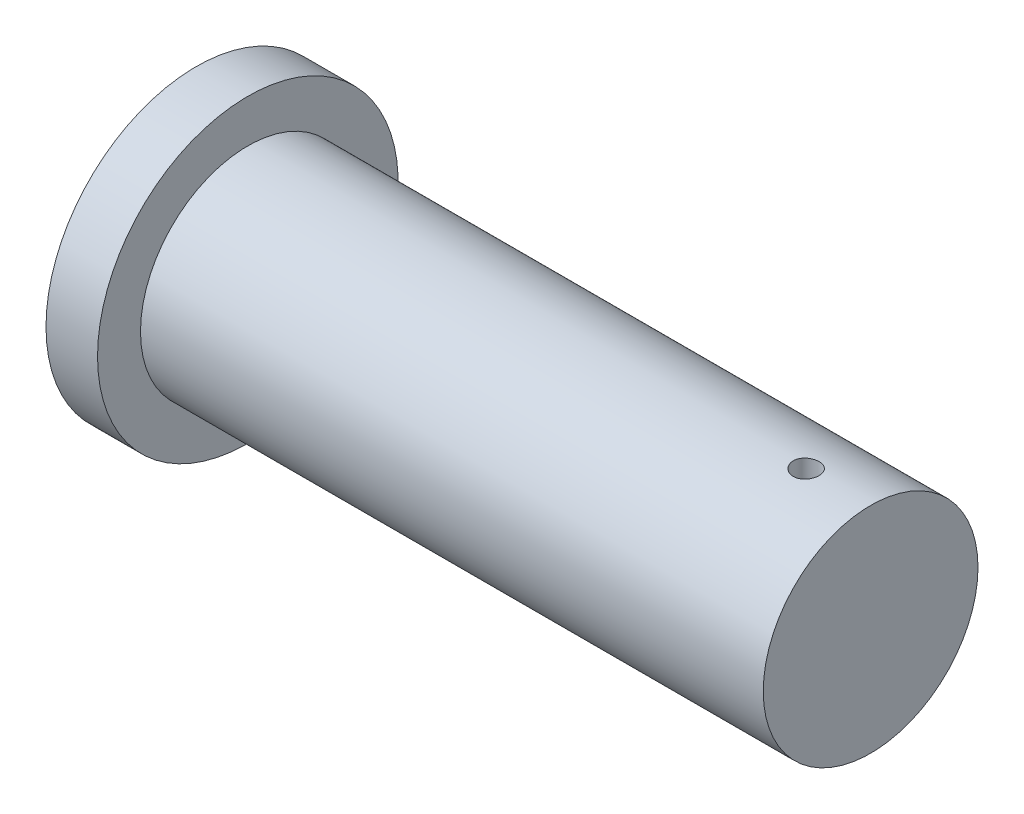
ISO-10303-21;
HEADER;
FILE_DESCRIPTION(('STEP AP214'),'2;1');
FILE_NAME('part.step','',(''),(''),'','','');
FILE_SCHEMA(('AUTOMOTIVE_DESIGN { 1 0 10303 214 1 1 1 1 }'));
ENDSEC;
DATA;
#1=APPLICATION_CONTEXT('core data for automotive mechanical design processes');
#2=APPLICATION_PROTOCOL_DEFINITION('international standard','automotive_design',2000,#1);
#3=PRODUCT_CONTEXT('',#1,'mechanical');
#4=PRODUCT('Part','Part','',(#3));
#5=PRODUCT_RELATED_PRODUCT_CATEGORY('part','',(#4));
#6=PRODUCT_DEFINITION_FORMATION('','',#4);
#7=PRODUCT_DEFINITION_CONTEXT('part definition',#1,'design');
#8=PRODUCT_DEFINITION('design','',#6,#7);
#9=PRODUCT_DEFINITION_SHAPE('','',#8);
#10=(LENGTH_UNIT() NAMED_UNIT(*) SI_UNIT(.MILLI.,.METRE.));
#11=(NAMED_UNIT(*) PLANE_ANGLE_UNIT() SI_UNIT($,.RADIAN.));
#12=(NAMED_UNIT(*) SI_UNIT($,.STERADIAN.) SOLID_ANGLE_UNIT());
#13=UNCERTAINTY_MEASURE_WITH_UNIT(LENGTH_MEASURE(1.E-05),#10,'distance_accuracy_value','');
#14=(GEOMETRIC_REPRESENTATION_CONTEXT(3) GLOBAL_UNCERTAINTY_ASSIGNED_CONTEXT((#13)) GLOBAL_UNIT_ASSIGNED_CONTEXT((#10,
#11,#12)) REPRESENTATION_CONTEXT('',''));
#15=CARTESIAN_POINT('',(0.,0.,0.));
#16=DIRECTION('',(0.,0.,1.));
#17=DIRECTION('',(1.,0.,0.));
#18=AXIS2_PLACEMENT_3D('',#15,#16,#17);
#19=CARTESIAN_POINT('',(-157.,0.,0.));
#20=DIRECTION('',(-1.,0.,0.));
#21=DIRECTION('',(0.,0.,1.));
#22=AXIS2_PLACEMENT_3D('',#19,#20,#21);
#23=CYLINDRICAL_SURFACE('',#22,25.);
#24=CARTESIAN_POINT('',(-145.,0.,0.));
#25=DIRECTION('',(-1.,0.,0.));
#26=DIRECTION('',(0.,0.,1.));
#27=AXIS2_PLACEMENT_3D('',#24,#25,#26);
#28=CIRCLE('',#27,25.);
#29=CARTESIAN_POINT('',(-145.,0.,25.));
#30=VERTEX_POINT('',#29);
#31=EDGE_CURVE('E56',#30,#30,#28,.T.);
#32=ORIENTED_EDGE('',*,*,#31,.F.);
#33=EDGE_LOOP('',(#32));
#34=FACE_BOUND('',#33,.T.);
#35=CARTESIAN_POINT('',(0.,0.,0.));
#36=DIRECTION('',(-1.,0.,0.));
#37=DIRECTION('',(0.,0.,1.));
#38=AXIS2_PLACEMENT_3D('',#35,#36,#37);
#39=CIRCLE('',#38,25.);
#40=CARTESIAN_POINT('',(0.,0.,25.));
#41=VERTEX_POINT('',#40);
#42=EDGE_CURVE('E10',#41,#41,#39,.T.);
#43=ORIENTED_EDGE('',*,*,#42,.T.);
#44=EDGE_LOOP('',(#43));
#45=FACE_BOUND('',#44,.T.);
#46=CARTESIAN_POINT('',(-15.,-24.8193472919817,-3.));
#47=CARTESIAN_POINT('',(-14.8321408588001,-24.819349617552,-2.99999283172714));
#48=CARTESIAN_POINT('',(-14.6641754798501,-24.8210685774632,-2.98586413495824));
#49=CARTESIAN_POINT('',(-14.3329153879421,-24.8277564496115,-2.92972318709126));
#50=CARTESIAN_POINT('',(-14.1696258043137,-24.8327287982131,-2.88768145238964));
#51=CARTESIAN_POINT('',(-13.8525615944954,-24.8453523109071,-2.77696834616031));
#52=CARTESIAN_POINT('',(-13.6987807388662,-24.8530016988387,-2.708314627898));
#53=CARTESIAN_POINT('',(-13.4049528578965,-24.8701152498661,-2.5463633755789));
#54=CARTESIAN_POINT('',(-13.2649034084313,-24.8795790917656,-2.45307020212001));
#55=CARTESIAN_POINT('',(-13.0017602283905,-24.8993100054925,-2.24397143930053));
#56=CARTESIAN_POINT('',(-12.8787477056515,-24.9095805816582,-2.1280639725065));
#57=CARTESIAN_POINT('',(-12.6538712818379,-24.9297361585383,-1.87724586434875));
#58=CARTESIAN_POINT('',(-12.5520084140581,-24.9396211403948,-1.74233429505413));
#59=CARTESIAN_POINT('',(-12.3720334670637,-24.9579274023081,-1.45682956846799));
#60=CARTESIAN_POINT('',(-12.2939945842603,-24.9663441380671,-1.30618995384899));
#61=CARTESIAN_POINT('',(-12.1643515396152,-24.9807271243236,-0.993825767272774));
#62=CARTESIAN_POINT('',(-12.1127464702522,-24.9866934589465,-0.832101576085541));
#63=CARTESIAN_POINT('',(-12.0376777438965,-24.9954787324527,-0.502987856985083));
#64=CARTESIAN_POINT('',(-12.0140793465542,-24.9983127364408,-0.335629471043379));
#65=CARTESIAN_POINT('',(-11.9952764006894,-25.0005654366101,0.000694496668565301));
#66=CARTESIAN_POINT('',(-12.0000708178417,-24.9999842572034,0.169660019668339));
#67=CARTESIAN_POINT('',(-12.0378091218513,-24.9954842925266,0.50348566751753));
#68=CARTESIAN_POINT('',(-12.0706081049724,-24.9915826884338,0.668362437568212));
#69=CARTESIAN_POINT('',(-12.163198151716,-24.9808996422381,0.990254370091176));
#70=CARTESIAN_POINT('',(-12.2229896941816,-24.9741181490466,1.1472693930426));
#71=CARTESIAN_POINT('',(-12.3680227289065,-24.9584077904553,1.44943112325937));
#72=CARTESIAN_POINT('',(-12.4533272360064,-24.9494736188692,1.59454729727538));
#73=CARTESIAN_POINT('',(-12.6469188989561,-24.9304580967161,1.86845892019878));
#74=CARTESIAN_POINT('',(-12.7552070264156,-24.9203766976596,1.99725367876689));
#75=CARTESIAN_POINT('',(-12.9925043495404,-24.9001206745296,2.23571721123049));
#76=CARTESIAN_POINT('',(-13.1216397813735,-24.8899458632542,2.34526038878379));
#77=CARTESIAN_POINT('',(-13.3965315136795,-24.8707126046074,2.54113591825157));
#78=CARTESIAN_POINT('',(-13.5422878591644,-24.8616541602595,2.62746820730526));
#79=CARTESIAN_POINT('',(-13.8463924901473,-24.8456792055215,2.77447678358649));
#80=CARTESIAN_POINT('',(-14.0047454412579,-24.8387634934567,2.83514351157641));
#81=CARTESIAN_POINT('',(-14.3294923595011,-24.8278728306611,2.92899010032377));
#82=CARTESIAN_POINT('',(-14.4958859701193,-24.8238977496731,2.96217117858551));
#83=CARTESIAN_POINT('',(-14.8308830963766,-24.8193620015637,2.99993928712165));
#84=CARTESIAN_POINT('',(-14.9994664358811,-24.8187802560634,3.00470284270772));
#85=CARTESIAN_POINT('',(-15.3350287808429,-24.8210413301146,2.98596598055603));
#86=CARTESIAN_POINT('',(-15.5020078176873,-24.82388408253,2.96246611691248));
#87=CARTESIAN_POINT('',(-15.8290957835979,-24.8326546274978,2.88801791942018));
#88=CARTESIAN_POINT('',(-15.9892243468093,-24.8385728602158,2.83715462498937));
#89=CARTESIAN_POINT('',(-16.2986792829759,-24.8528197853248,2.70951076792624));
#90=CARTESIAN_POINT('',(-16.448005304503,-24.8611485560914,2.63272936258612));
#91=CARTESIAN_POINT('',(-16.7324162949746,-24.8793287313299,2.45499302721611));
#92=CARTESIAN_POINT('',(-16.8674282868813,-24.8891873609855,2.35392207141476));
#93=CARTESIAN_POINT('',(-17.1186351130117,-24.9092935540369,2.13064017836707));
#94=CARTESIAN_POINT('',(-17.2348292734058,-24.9195411313438,2.0084284844362));
#95=CARTESIAN_POINT('',(-17.4457197472349,-24.939335094491,1.74556427266772));
#96=CARTESIAN_POINT('',(-17.5403002465114,-24.9488775256031,1.60481849941783));
#97=CARTESIAN_POINT('',(-17.7044782093291,-24.966127243116,1.30933642941058));
#98=CARTESIAN_POINT('',(-17.7740761423744,-24.9738345640038,1.15460039564441));
#99=CARTESIAN_POINT('',(-17.8861210048758,-24.9865280430514,0.835919244719985));
#100=CARTESIAN_POINT('',(-17.9286355198842,-24.9915209702628,0.671998170647181));
#101=CARTESIAN_POINT('',(-17.9855267435821,-24.9982511364507,0.339280584991476));
#102=CARTESIAN_POINT('',(-17.9999046166931,-24.9999885101567,0.170484275461259));
#103=CARTESIAN_POINT('',(-18.0000938441123,-25.0000113048646,-0.166060006255657));
#104=CARTESIAN_POINT('',(-17.9860840366832,-24.9983183365244,-0.333807904658863));
#105=CARTESIAN_POINT('',(-17.9302735450975,-24.9917135402075,-0.664547224796242));
#106=CARTESIAN_POINT('',(-17.8884728700504,-24.9868017132859,-0.827538648089519));
#107=CARTESIAN_POINT('',(-17.7783219848684,-24.9743088019473,-1.14411955598358));
#108=CARTESIAN_POINT('',(-17.7099796355457,-24.9667285079088,-1.29771180874788));
#109=CARTESIAN_POINT('',(-17.5487039304153,-24.9497392443223,-1.59127541052543));
#110=CARTESIAN_POINT('',(-17.4557703755961,-24.9403302599753,-1.73124664929415));
#111=CARTESIAN_POINT('',(-17.2472863179947,-24.920663936203,-1.99450948424813));
#112=CARTESIAN_POINT('',(-17.1316026446778,-24.910401817522,-2.11769526787512));
#113=CARTESIAN_POINT('',(-16.8811769628439,-24.8902246865463,-2.34297730712576));
#114=CARTESIAN_POINT('',(-16.7464304354851,-24.88030975725,-2.44506854813713));
#115=CARTESIAN_POINT('',(-16.4611570638409,-24.8619119204259,-2.62557074728252));
#116=CARTESIAN_POINT('',(-16.3105756717734,-24.8534342444192,-2.70389598198192));
#117=CARTESIAN_POINT('',(-15.9983822462959,-24.8389322365013,-2.8340380582164));
#118=CARTESIAN_POINT('',(-15.8367825288144,-24.8329052161653,-2.88588396425552));
#119=CARTESIAN_POINT('',(-15.5619404608884,-24.8254627238532,-2.94907010073915));
#120=CARTESIAN_POINT('',(-15.4504372480377,-24.8231807309863,-2.96814164942005));
#121=CARTESIAN_POINT('',(-15.2259720678681,-24.8201222373143,-2.99360896909453));
#122=CARTESIAN_POINT('',(-15.1130101104407,-24.8193457263061,-3.00000482599459));
#123=CARTESIAN_POINT('',(-15.,-24.8193472919817,-3.));
#124=B_SPLINE_CURVE_WITH_KNOTS('',3,(#46,#47,#48,#49,#50,#51,#52,#53,#54,#55,#56,#57,#58,#59,
#60,#61,#62,#63,#64,#65,#66,#67,#68,#69,#70,#71,#72,#73,#74,#75,#76,#77,#78,#79,#80,#81,#82,#83,
#84,#85,#86,#87,#88,#89,#90,#91,#92,#93,#94,#95,#96,#97,#98,#99,#100,#101,#102,#103,#104,#105,
#106,#107,#108,#109,#110,#111,#112,#113,#114,#115,#116,#117,#118,#119,#120,#121,#122,#123),
.UNSPECIFIED.,.T.,.F.,(4,2,2,2,2,2,2,2,2,2,2,2,2,2,2,2,2,2,2,2,2,2,2,2,2,2,2,2,2,2,2,2,2,2,2,2,
2,2,4),(0.,0.503164613232923,1.00686154966524,1.51022492507114,2.01349927674882,
2.51909553323416,3.02471648549883,3.53187561756201,4.03901733675556,4.54370917218765,
5.04838262225285,5.55046046161349,6.05254720809332,6.55588445357932,7.05924298138498,
7.56577244411506,8.07230327863779,8.57902260679249,9.08571948810824,9.58926554088957,
10.0928017219916,10.5947819896887,11.0967785804672,11.6012225031328,12.105684484956,
12.6127892929794,13.119884570345,13.6257094034364,14.1315133027652,14.6341406188081,
15.1367677700954,15.6392461723566,16.1417286411941,16.6472450412647,17.1528814752089,
17.6603206216507,18.1672015841626,18.5059562893408,18.8447086986815),.UNSPECIFIED.);
#125=CARTESIAN_POINT('',(-15.,-24.8193472919817,-3.));
#126=VERTEX_POINT('',#125);
#127=EDGE_CURVE('E65',#126,#126,#124,.T.);
#128=ORIENTED_EDGE('',*,*,#127,.F.);
#129=EDGE_LOOP('',(#128));
#130=FACE_BOUND('',#129,.T.);
#131=CARTESIAN_POINT('',(-15.,24.8193472919817,-3.));
#132=CARTESIAN_POINT('',(-15.1678591411998,24.819349617552,-2.99999283172714));
#133=CARTESIAN_POINT('',(-15.3358245201498,24.8210685774632,-2.98586413495824));
#134=CARTESIAN_POINT('',(-15.6670846120578,24.8277564496115,-2.92972318709126));
#135=CARTESIAN_POINT('',(-15.8303741956862,24.8327287982131,-2.88768145238964));
#136=CARTESIAN_POINT('',(-16.1474384055045,24.8453523109071,-2.77696834616031));
#137=CARTESIAN_POINT('',(-16.3012192611337,24.8530016988387,-2.708314627898));
#138=CARTESIAN_POINT('',(-16.5950471421034,24.8701152498661,-2.5463633755789));
#139=CARTESIAN_POINT('',(-16.7350965915686,24.8795790917656,-2.45307020212001));
#140=CARTESIAN_POINT('',(-16.9982397716095,24.8993100054925,-2.24397143930053));
#141=CARTESIAN_POINT('',(-17.1212522943484,24.9095805816582,-2.1280639725065));
#142=CARTESIAN_POINT('',(-17.346128718162,24.9297361585383,-1.87724586434875));
#143=CARTESIAN_POINT('',(-17.4479915859418,24.9396211403948,-1.74233429505413));
#144=CARTESIAN_POINT('',(-17.6279665329362,24.9579274023081,-1.45682956846799));
#145=CARTESIAN_POINT('',(-17.7060054157396,24.9663441380671,-1.30618995384899));
#146=CARTESIAN_POINT('',(-17.8356484603847,24.9807271243236,-0.993825767272776));
#147=CARTESIAN_POINT('',(-17.8872535297477,24.9866934589465,-0.832101576085543));
#148=CARTESIAN_POINT('',(-17.9623222561034,24.9954787324527,-0.502987856985085));
#149=CARTESIAN_POINT('',(-17.9859206534457,24.9983127364408,-0.335629471043381));
#150=CARTESIAN_POINT('',(-18.0047235993105,25.0005654366101,0.000694496668564027));
#151=CARTESIAN_POINT('',(-17.9999291821582,24.9999842572034,0.169660019668338));
#152=CARTESIAN_POINT('',(-17.9621908781486,24.9954842925266,0.503485667517529));
#153=CARTESIAN_POINT('',(-17.9293918950276,24.9915826884338,0.668362437568212));
#154=CARTESIAN_POINT('',(-17.836801848284,24.9808996422381,0.990254370091175));
#155=CARTESIAN_POINT('',(-17.7770103058183,24.9741181490466,1.1472693930426));
#156=CARTESIAN_POINT('',(-17.6319772710934,24.9584077904553,1.44943112325937));
#157=CARTESIAN_POINT('',(-17.5466727639935,24.9494736188692,1.59454729727538));
#158=CARTESIAN_POINT('',(-17.3530811010438,24.9304580967161,1.86845892019878));
#159=CARTESIAN_POINT('',(-17.2447929735843,24.9203766976596,1.99725367876689));
#160=CARTESIAN_POINT('',(-17.0074956504595,24.9001206745296,2.23571721123049));
#161=CARTESIAN_POINT('',(-16.8783602186265,24.8899458632542,2.34526038878379));
#162=CARTESIAN_POINT('',(-16.6034684863205,24.8707126046074,2.54113591825157));
#163=CARTESIAN_POINT('',(-16.4577121408355,24.8616541602595,2.62746820730525));
#164=CARTESIAN_POINT('',(-16.1536075098526,24.8456792055215,2.77447678358649));
#165=CARTESIAN_POINT('',(-15.9952545587421,24.8387634934567,2.83514351157641));
#166=CARTESIAN_POINT('',(-15.6705076404988,24.8278728306611,2.92899010032377));
#167=CARTESIAN_POINT('',(-15.5041140298807,24.8238977496731,2.96217117858551));
#168=CARTESIAN_POINT('',(-15.1691169036233,24.8193620015637,2.99993928712165));
#169=CARTESIAN_POINT('',(-15.0005335641188,24.8187802560634,3.00470284270772));
#170=CARTESIAN_POINT('',(-14.664971219157,24.8210413301146,2.98596598055602));
#171=CARTESIAN_POINT('',(-14.4979921823126,24.82388408253,2.96246611691248));
#172=CARTESIAN_POINT('',(-14.170904216402,24.8326546274978,2.88801791942018));
#173=CARTESIAN_POINT('',(-14.0107756531906,24.8385728602158,2.83715462498938));
#174=CARTESIAN_POINT('',(-13.701320717024,24.8528197853248,2.70951076792624));
#175=CARTESIAN_POINT('',(-13.5519946954969,24.8611485560914,2.63272936258612));
#176=CARTESIAN_POINT('',(-13.2675837050253,24.8793287313299,2.45499302721611));
#177=CARTESIAN_POINT('',(-13.1325717131187,24.8891873609855,2.35392207141476));
#178=CARTESIAN_POINT('',(-12.8813648869882,24.9092935540369,2.13064017836707));
#179=CARTESIAN_POINT('',(-12.7651707265941,24.9195411313438,2.0084284844362));
#180=CARTESIAN_POINT('',(-12.554280252765,24.939335094491,1.74556427266772));
#181=CARTESIAN_POINT('',(-12.4596997534885,24.9488775256031,1.60481849941783));
#182=CARTESIAN_POINT('',(-12.2955217906709,24.966127243116,1.30933642941058));
#183=CARTESIAN_POINT('',(-12.2259238576255,24.9738345640038,1.15460039564442));
#184=CARTESIAN_POINT('',(-12.1138789951242,24.9865280430514,0.835919244719987));
#185=CARTESIAN_POINT('',(-12.0713644801157,24.9915209702628,0.671998170647183));
#186=CARTESIAN_POINT('',(-12.0144732564178,24.9982511364507,0.339280584991479));
#187=CARTESIAN_POINT('',(-12.0000953833068,24.9999885101567,0.17048427546126));
#188=CARTESIAN_POINT('',(-11.9999061558876,25.0000113048646,-0.166060006255655));
#189=CARTESIAN_POINT('',(-12.0139159633167,24.9983183365244,-0.333807904658862));
#190=CARTESIAN_POINT('',(-12.0697264549025,24.9917135402075,-0.664547224796241));
#191=CARTESIAN_POINT('',(-12.1115271299495,24.9868017132859,-0.827538648089518));
#192=CARTESIAN_POINT('',(-12.2216780151315,24.9743088019473,-1.14411955598358));
#193=CARTESIAN_POINT('',(-12.2900203644542,24.9667285079088,-1.29771180874788));
#194=CARTESIAN_POINT('',(-12.4512960695846,24.9497392443223,-1.59127541052543));
#195=CARTESIAN_POINT('',(-12.5442296244038,24.9403302599753,-1.73124664929415));
#196=CARTESIAN_POINT('',(-12.7527136820052,24.920663936203,-1.99450948424813));
#197=CARTESIAN_POINT('',(-12.8683973553221,24.910401817522,-2.11769526787512));
#198=CARTESIAN_POINT('',(-13.118823037156,24.8902246865463,-2.34297730712576));
#199=CARTESIAN_POINT('',(-13.2535695645148,24.88030975725,-2.44506854813713));
#200=CARTESIAN_POINT('',(-13.538842936159,24.8619119204259,-2.62557074728252));
#201=CARTESIAN_POINT('',(-13.6894243282265,24.8534342444192,-2.70389598198192));
#202=CARTESIAN_POINT('',(-14.001617753704,24.8389322365013,-2.8340380582164));
#203=CARTESIAN_POINT('',(-14.1632174711855,24.8329052161653,-2.88588396425552));
#204=CARTESIAN_POINT('',(-14.4380595391115,24.8254627238532,-2.94907010073915));
#205=CARTESIAN_POINT('',(-14.5495627519622,24.8231807309863,-2.96814164942005));
#206=CARTESIAN_POINT('',(-14.7740279321318,24.8201222373143,-2.99360896909453));
#207=CARTESIAN_POINT('',(-14.8869898895592,24.8193457263061,-3.00000482599459));
#208=CARTESIAN_POINT('',(-15.,24.8193472919817,-3.));
#209=B_SPLINE_CURVE_WITH_KNOTS('',3,(#131,#132,#133,#134,#135,#136,#137,#138,#139,#140,#141,
#142,#143,#144,#145,#146,#147,#148,#149,#150,#151,#152,#153,#154,#155,#156,#157,#158,#159,#160,
#161,#162,#163,#164,#165,#166,#167,#168,#169,#170,#171,#172,#173,#174,#175,#176,#177,#178,#179,
#180,#181,#182,#183,#184,#185,#186,#187,#188,#189,#190,#191,#192,#193,#194,#195,#196,#197,#198,
#199,#200,#201,#202,#203,#204,#205,#206,#207,#208),.UNSPECIFIED.,.T.,.F.,(4,2,2,2,2,2,2,2,2,2,2,
2,2,2,2,2,2,2,2,2,2,2,2,2,2,2,2,2,2,2,2,2,2,2,2,2,2,2,4),(0.,0.503164613232923,1.00686154966524,
1.51022492507114,2.01349927674882,2.51909553323415,3.02471648549882,3.531875617562,
4.03901733675556,4.54370917218765,5.04838262225285,5.55046046161349,6.05254720809332,
6.55588445357932,7.05924298138498,7.56577244411505,8.07230327863779,8.57902260679249,
9.08571948810824,9.58926554088957,10.0928017219916,10.5947819896887,11.0967785804672,
11.6012225031328,12.105684484956,12.6127892929794,13.119884570345,13.6257094034364,
14.1315133027652,14.6341406188081,15.1367677700954,15.6392461723566,16.1417286411941,
16.6472450412647,17.1528814752089,17.6603206216507,18.1672015841626,18.5059562893408,
18.8447086986815),.UNSPECIFIED.);
#210=CARTESIAN_POINT('',(-15.,24.8193472919817,-3.));
#211=VERTEX_POINT('',#210);
#212=EDGE_CURVE('E47',#211,#211,#209,.T.);
#213=ORIENTED_EDGE('',*,*,#212,.F.);
#214=EDGE_LOOP('',(#213));
#215=FACE_BOUND('',#214,.T.);
#216=ADVANCED_FACE('F43',(#34,#45,#130,#215),#23,.T.);
#217=CARTESIAN_POINT('',(0.,0.,0.));
#218=DIRECTION('',(-1.,0.,0.));
#219=DIRECTION('',(0.,0.,1.));
#220=AXIS2_PLACEMENT_3D('',#217,#218,#219);
#221=PLANE('',#220);
#222=ORIENTED_EDGE('',*,*,#42,.F.);
#223=EDGE_LOOP('',(#222));
#224=FACE_BOUND('',#223,.T.);
#225=ADVANCED_FACE('F45',(#224),#221,.F.);
#226=CARTESIAN_POINT('',(-145.,25.,0.));
#227=DIRECTION('',(-1.,0.,0.));
#228=DIRECTION('',(0.,0.,1.));
#229=AXIS2_PLACEMENT_3D('',#226,#227,#228);
#230=PLANE('',#229);
#231=CARTESIAN_POINT('',(-145.,0.,0.));
#232=DIRECTION('',(-1.,0.,0.));
#233=DIRECTION('',(0.,0.,1.));
#234=AXIS2_PLACEMENT_3D('',#231,#232,#233);
#235=CIRCLE('',#234,35.);
#236=CARTESIAN_POINT('',(-145.,0.,35.));
#237=VERTEX_POINT('',#236);
#238=EDGE_CURVE('E62',#237,#237,#235,.T.);
#239=ORIENTED_EDGE('',*,*,#238,.F.);
#240=EDGE_LOOP('',(#239));
#241=FACE_BOUND('',#240,.T.);
#242=ORIENTED_EDGE('',*,*,#31,.T.);
#243=EDGE_LOOP('',(#242));
#244=FACE_BOUND('',#243,.T.);
#245=ADVANCED_FACE('F85',(#241,#244),#230,.F.);
#246=CARTESIAN_POINT('',(-157.,0.,0.));
#247=DIRECTION('',(-1.,0.,0.));
#248=DIRECTION('',(0.,0.,1.));
#249=AXIS2_PLACEMENT_3D('',#246,#247,#248);
#250=CYLINDRICAL_SURFACE('',#249,35.);
#251=CARTESIAN_POINT('',(-157.,0.,0.));
#252=DIRECTION('',(-1.,0.,0.));
#253=DIRECTION('',(0.,0.,1.));
#254=AXIS2_PLACEMENT_3D('',#251,#252,#253);
#255=CIRCLE('',#254,35.);
#256=CARTESIAN_POINT('',(-157.,0.,35.));
#257=VERTEX_POINT('',#256);
#258=EDGE_CURVE('E107',#257,#257,#255,.T.);
#259=ORIENTED_EDGE('',*,*,#258,.F.);
#260=EDGE_LOOP('',(#259));
#261=FACE_BOUND('',#260,.T.);
#262=ORIENTED_EDGE('',*,*,#238,.T.);
#263=EDGE_LOOP('',(#262));
#264=FACE_BOUND('',#263,.T.);
#265=ADVANCED_FACE('F82',(#261,#264),#250,.T.);
#266=CARTESIAN_POINT('',(-157.,35.,0.));
#267=DIRECTION('',(1.,0.,0.));
#268=DIRECTION('',(0.,0.,-1.));
#269=AXIS2_PLACEMENT_3D('',#266,#267,#268);
#270=PLANE('',#269);
#271=ORIENTED_EDGE('',*,*,#258,.T.);
#272=EDGE_LOOP('',(#271));
#273=FACE_BOUND('',#272,.T.);
#274=ADVANCED_FACE('F77',(#273),#270,.F.);
#275=CARTESIAN_POINT('',(-15.,36.,0.));
#276=DIRECTION('',(0.,-1.,0.));
#277=DIRECTION('',(0.,0.,-1.));
#278=AXIS2_PLACEMENT_3D('',#275,#276,#277);
#279=CYLINDRICAL_SURFACE('',#278,3.);
#280=ORIENTED_EDGE('',*,*,#127,.T.);
#281=EDGE_LOOP('',(#280));
#282=FACE_BOUND('',#281,.T.);
#283=ORIENTED_EDGE('',*,*,#212,.T.);
#284=EDGE_LOOP('',(#283));
#285=FACE_BOUND('',#284,.T.);
#286=ADVANCED_FACE('F73',(#282,#285),#279,.F.);
#287=CLOSED_SHELL('',(#216,#225,#245,#265,#274,#286));
#288=MANIFOLD_SOLID_BREP('B2',#287);
#289=ADVANCED_BREP_SHAPE_REPRESENTATION('',(#18,#288),#14);
#290=SHAPE_DEFINITION_REPRESENTATION(#9,#289);
ENDSEC;
END-ISO-10303-21;
